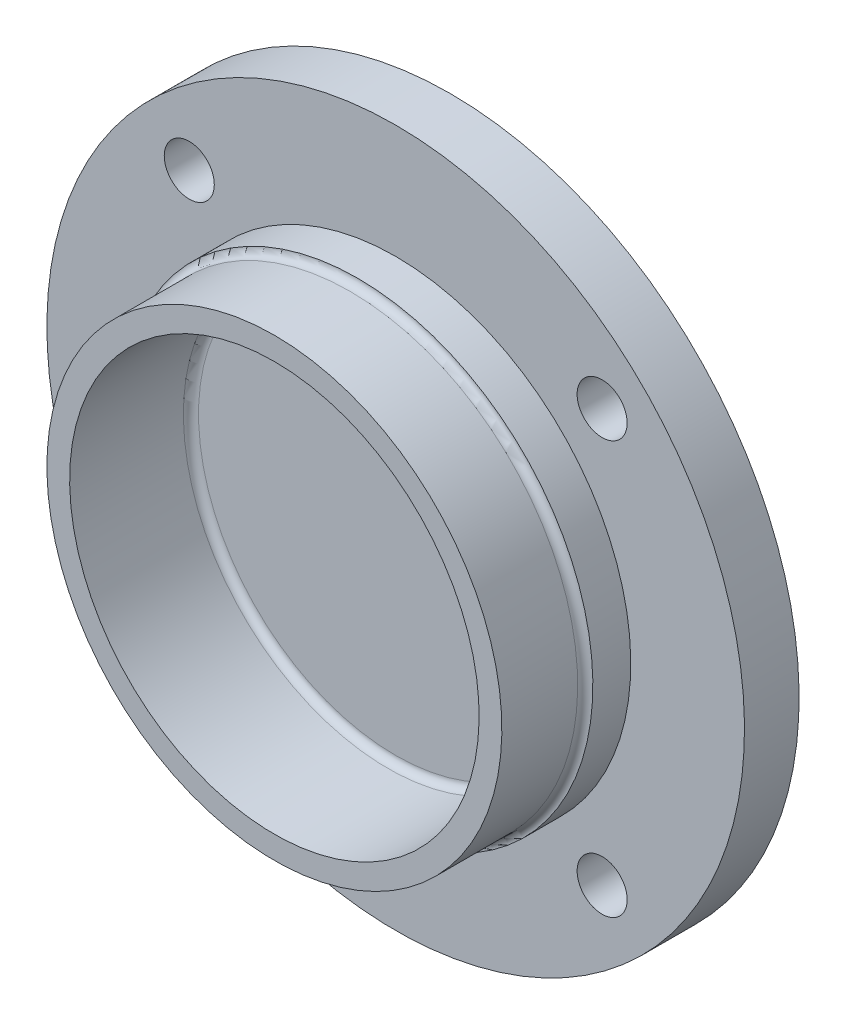
ISO-10303-21;
HEADER;
FILE_DESCRIPTION(('STEP AP214'),'2;1');
FILE_NAME('part.step','',(''),(''),'','','');
FILE_SCHEMA(('AUTOMOTIVE_DESIGN { 1 0 10303 214 1 1 1 1 }'));
ENDSEC;
DATA;
#1=APPLICATION_CONTEXT('core data for automotive mechanical design processes');
#2=APPLICATION_PROTOCOL_DEFINITION('international standard','automotive_design',2000,#1);
#3=PRODUCT_CONTEXT('',#1,'mechanical');
#4=PRODUCT('Part','Part','',(#3));
#5=PRODUCT_RELATED_PRODUCT_CATEGORY('part','',(#4));
#6=PRODUCT_DEFINITION_FORMATION('','',#4);
#7=PRODUCT_DEFINITION_CONTEXT('part definition',#1,'design');
#8=PRODUCT_DEFINITION('design','',#6,#7);
#9=PRODUCT_DEFINITION_SHAPE('','',#8);
#10=(LENGTH_UNIT() NAMED_UNIT(*) SI_UNIT(.MILLI.,.METRE.));
#11=(NAMED_UNIT(*) PLANE_ANGLE_UNIT() SI_UNIT($,.RADIAN.));
#12=(NAMED_UNIT(*) SI_UNIT($,.STERADIAN.) SOLID_ANGLE_UNIT());
#13=UNCERTAINTY_MEASURE_WITH_UNIT(LENGTH_MEASURE(1.E-05),#10,'distance_accuracy_value','');
#14=(GEOMETRIC_REPRESENTATION_CONTEXT(3) GLOBAL_UNCERTAINTY_ASSIGNED_CONTEXT((#13)) GLOBAL_UNIT_ASSIGNED_CONTEXT((#10,
#11,#12)) REPRESENTATION_CONTEXT('',''));
#15=CARTESIAN_POINT('',(0.,0.,0.));
#16=DIRECTION('',(0.,0.,1.));
#17=DIRECTION('',(1.,0.,0.));
#18=AXIS2_PLACEMENT_3D('',#15,#16,#17);
#19=CARTESIAN_POINT('',(0.,29.,-5.2));
#20=DIRECTION('',(0.,0.,-1.));
#21=DIRECTION('',(0.,1.,0.));
#22=AXIS2_PLACEMENT_3D('',#19,#20,#21);
#23=PLANE('',#22);
#24=CARTESIAN_POINT('',(0.,0.,-5.20000000000001));
#25=DIRECTION('',(0.,0.,-1.));
#26=DIRECTION('',(0.,1.,0.));
#27=AXIS2_PLACEMENT_3D('',#24,#25,#26);
#28=CIRCLE('',#27,29.);
#29=CARTESIAN_POINT('',(0.,29.,-5.2));
#30=VERTEX_POINT('',#29);
#31=EDGE_CURVE('E10',#30,#30,#28,.T.);
#32=ORIENTED_EDGE('',*,*,#31,.T.);
#33=EDGE_LOOP('',(#32));
#34=FACE_BOUND('',#33,.T.);
#35=ADVANCED_FACE('F37',(#34),#23,.T.);
#36=CARTESIAN_POINT('',(0.,0.,-5.20000000000001));
#37=DIRECTION('',(0.,0.,-1.));
#38=DIRECTION('',(0.,1.,0.));
#39=AXIS2_PLACEMENT_3D('',#36,#37,#38);
#40=CONICAL_SURFACE('',#39,29.,0.785398163397448);
#41=CARTESIAN_POINT('',(0.,0.,-7.20000000000001));
#42=DIRECTION('',(0.,0.,-1.));
#43=DIRECTION('',(0.,1.,0.));
#44=AXIS2_PLACEMENT_3D('',#41,#42,#43);
#45=CIRCLE('',#44,31.);
#46=CARTESIAN_POINT('',(0.,31.,-7.2));
#47=VERTEX_POINT('',#46);
#48=EDGE_CURVE('E43',#47,#47,#45,.T.);
#49=ORIENTED_EDGE('',*,*,#48,.T.);
#50=EDGE_LOOP('',(#49));
#51=FACE_BOUND('',#50,.T.);
#52=ORIENTED_EDGE('',*,*,#31,.F.);
#53=EDGE_LOOP('',(#52));
#54=FACE_BOUND('',#53,.T.);
#55=ADVANCED_FACE('F109',(#51,#54),#40,.F.);
#56=CARTESIAN_POINT('',(0.,46.,-7.2));
#57=DIRECTION('',(0.,0.,-1.));
#58=DIRECTION('',(0.,1.,0.));
#59=AXIS2_PLACEMENT_3D('',#56,#57,#58);
#60=PLANE('',#59);
#61=CARTESIAN_POINT('',(-27.2236110756823,-27.2236110756818,-7.20000000000001));
#62=DIRECTION('',(0.,0.,-1.));
#63=DIRECTION('',(0.,1.,0.));
#64=AXIS2_PLACEMENT_3D('',#61,#62,#63);
#65=CIRCLE('',#64,3.3);
#66=CARTESIAN_POINT('',(-27.2236110756823,-23.9236110756818,-7.20000000000001));
#67=VERTEX_POINT('',#66);
#68=EDGE_CURVE('E98',#67,#67,#65,.T.);
#69=ORIENTED_EDGE('',*,*,#68,.F.);
#70=EDGE_LOOP('',(#69));
#71=FACE_BOUND('',#70,.T.);
#72=CARTESIAN_POINT('',(27.2236110756821,-27.223611075682,-7.20000000000001));
#73=DIRECTION('',(0.,0.,-1.));
#74=DIRECTION('',(0.,1.,0.));
#75=AXIS2_PLACEMENT_3D('',#72,#73,#74);
#76=CIRCLE('',#75,3.3);
#77=CARTESIAN_POINT('',(27.2236110756821,-23.923611075682,-7.20000000000001));
#78=VERTEX_POINT('',#77);
#79=EDGE_CURVE('E92',#78,#78,#76,.T.);
#80=ORIENTED_EDGE('',*,*,#79,.F.);
#81=EDGE_LOOP('',(#80));
#82=FACE_BOUND('',#81,.T.);
#83=CARTESIAN_POINT('',(27.2236110756821,27.223611075682,-7.2));
#84=DIRECTION('',(0.,0.,-1.));
#85=DIRECTION('',(0.,1.,0.));
#86=AXIS2_PLACEMENT_3D('',#83,#84,#85);
#87=CIRCLE('',#86,3.3);
#88=CARTESIAN_POINT('',(27.2236110756821,30.523611075682,-7.2));
#89=VERTEX_POINT('',#88);
#90=EDGE_CURVE('E86',#89,#89,#87,.T.);
#91=ORIENTED_EDGE('',*,*,#90,.F.);
#92=EDGE_LOOP('',(#91));
#93=FACE_BOUND('',#92,.T.);
#94=CARTESIAN_POINT('',(-27.2236110756821,27.223611075682,-7.2));
#95=DIRECTION('',(0.,0.,-1.));
#96=DIRECTION('',(0.,1.,0.));
#97=AXIS2_PLACEMENT_3D('',#94,#95,#96);
#98=CIRCLE('',#97,3.3);
#99=CARTESIAN_POINT('',(-27.2236110756821,30.523611075682,-7.2));
#100=VERTEX_POINT('',#99);
#101=EDGE_CURVE('E80',#100,#100,#98,.T.);
#102=ORIENTED_EDGE('',*,*,#101,.F.);
#103=EDGE_LOOP('',(#102));
#104=FACE_BOUND('',#103,.T.);
#105=CARTESIAN_POINT('',(0.,0.,-7.2));
#106=DIRECTION('',(0.,0.,-1.));
#107=DIRECTION('',(0.,1.,0.));
#108=AXIS2_PLACEMENT_3D('',#105,#106,#107);
#109=CIRCLE('',#108,46.);
#110=CARTESIAN_POINT('',(0.,46.,-7.2));
#111=VERTEX_POINT('',#110);
#112=EDGE_CURVE('E47',#111,#111,#109,.T.);
#113=ORIENTED_EDGE('',*,*,#112,.T.);
#114=EDGE_LOOP('',(#113));
#115=FACE_BOUND('',#114,.T.);
#116=ORIENTED_EDGE('',*,*,#48,.F.);
#117=EDGE_LOOP('',(#116));
#118=FACE_BOUND('',#117,.T.);
#119=ADVANCED_FACE('F105',(#71,#82,#93,#104,#115,#118),#60,.T.);
#120=CARTESIAN_POINT('',(0.,0.,-7.2));
#121=DIRECTION('',(0.,0.,-1.));
#122=DIRECTION('',(0.,1.,0.));
#123=AXIS2_PLACEMENT_3D('',#120,#121,#122);
#124=CYLINDRICAL_SURFACE('',#123,46.);
#125=CARTESIAN_POINT('',(0.,0.,0.));
#126=DIRECTION('',(0.,0.,-1.));
#127=DIRECTION('',(0.,1.,0.));
#128=AXIS2_PLACEMENT_3D('',#125,#126,#127);
#129=CIRCLE('',#128,46.);
#130=CARTESIAN_POINT('',(0.,46.,0.));
#131=VERTEX_POINT('',#130);
#132=EDGE_CURVE('E51',#131,#131,#129,.T.);
#133=ORIENTED_EDGE('',*,*,#132,.T.);
#134=EDGE_LOOP('',(#133));
#135=FACE_BOUND('',#134,.T.);
#136=ORIENTED_EDGE('',*,*,#112,.F.);
#137=EDGE_LOOP('',(#136));
#138=FACE_BOUND('',#137,.T.);
#139=ADVANCED_FACE('F108',(#135,#138),#124,.T.);
#140=CARTESIAN_POINT('',(0.,31.,0.));
#141=DIRECTION('',(0.,0.,1.));
#142=DIRECTION('',(0.,-1.,0.));
#143=AXIS2_PLACEMENT_3D('',#140,#141,#142);
#144=PLANE('',#143);
#145=CARTESIAN_POINT('',(-27.2236110756823,-27.2236110756818,0.));
#146=DIRECTION('',(0.,0.,1.));
#147=DIRECTION('',(0.,-1.,0.));
#148=AXIS2_PLACEMENT_3D('',#145,#146,#147);
#149=CIRCLE('',#148,3.3);
#150=CARTESIAN_POINT('',(-27.2236110756823,-30.5236110756818,0.));
#151=VERTEX_POINT('',#150);
#152=EDGE_CURVE('E95',#151,#151,#149,.T.);
#153=ORIENTED_EDGE('',*,*,#152,.F.);
#154=EDGE_LOOP('',(#153));
#155=FACE_BOUND('',#154,.T.);
#156=CARTESIAN_POINT('',(27.2236110756821,-27.223611075682,0.));
#157=DIRECTION('',(0.,0.,1.));
#158=DIRECTION('',(0.,-1.,0.));
#159=AXIS2_PLACEMENT_3D('',#156,#157,#158);
#160=CIRCLE('',#159,3.3);
#161=CARTESIAN_POINT('',(27.2236110756821,-30.523611075682,0.));
#162=VERTEX_POINT('',#161);
#163=EDGE_CURVE('E89',#162,#162,#160,.T.);
#164=ORIENTED_EDGE('',*,*,#163,.F.);
#165=EDGE_LOOP('',(#164));
#166=FACE_BOUND('',#165,.T.);
#167=CARTESIAN_POINT('',(27.2236110756821,27.223611075682,0.));
#168=DIRECTION('',(0.,0.,1.));
#169=DIRECTION('',(0.,-1.,0.));
#170=AXIS2_PLACEMENT_3D('',#167,#168,#169);
#171=CIRCLE('',#170,3.3);
#172=CARTESIAN_POINT('',(27.2236110756821,23.923611075682,0.));
#173=VERTEX_POINT('',#172);
#174=EDGE_CURVE('E83',#173,#173,#171,.T.);
#175=ORIENTED_EDGE('',*,*,#174,.F.);
#176=EDGE_LOOP('',(#175));
#177=FACE_BOUND('',#176,.T.);
#178=CARTESIAN_POINT('',(-27.2236110756821,27.223611075682,0.));
#179=DIRECTION('',(0.,0.,1.));
#180=DIRECTION('',(0.,-1.,0.));
#181=AXIS2_PLACEMENT_3D('',#178,#179,#180);
#182=CIRCLE('',#181,3.3);
#183=CARTESIAN_POINT('',(-27.2236110756821,23.923611075682,0.));
#184=VERTEX_POINT('',#183);
#185=EDGE_CURVE('E77',#184,#184,#182,.T.);
#186=ORIENTED_EDGE('',*,*,#185,.F.);
#187=EDGE_LOOP('',(#186));
#188=FACE_BOUND('',#187,.T.);
#189=CARTESIAN_POINT('',(0.,0.,0.));
#190=DIRECTION('',(0.,0.,-1.));
#191=DIRECTION('',(0.,1.,0.));
#192=AXIS2_PLACEMENT_3D('',#189,#190,#191);
#193=CIRCLE('',#192,31.);
#194=CARTESIAN_POINT('',(0.,31.,0.));
#195=VERTEX_POINT('',#194);
#196=EDGE_CURVE('E56',#195,#195,#193,.T.);
#197=ORIENTED_EDGE('',*,*,#196,.T.);
#198=EDGE_LOOP('',(#197));
#199=FACE_BOUND('',#198,.T.);
#200=ORIENTED_EDGE('',*,*,#132,.F.);
#201=EDGE_LOOP('',(#200));
#202=FACE_BOUND('',#201,.T.);
#203=ADVANCED_FACE('F121',(#155,#166,#177,#188,#199,#202),#144,.T.);
#204=CARTESIAN_POINT('',(0.,0.,-7.2));
#205=DIRECTION('',(0.,0.,-1.));
#206=DIRECTION('',(0.,1.,0.));
#207=AXIS2_PLACEMENT_3D('',#204,#205,#206);
#208=CYLINDRICAL_SURFACE('',#207,31.);
#209=CARTESIAN_POINT('',(0.,0.,5.));
#210=DIRECTION('',(0.,0.,-1.));
#211=DIRECTION('',(0.,1.,0.));
#212=AXIS2_PLACEMENT_3D('',#209,#210,#211);
#213=CIRCLE('',#212,31.);
#214=CARTESIAN_POINT('',(0.,31.,5.));
#215=VERTEX_POINT('',#214);
#216=EDGE_CURVE('E59',#215,#215,#213,.T.);
#217=ORIENTED_EDGE('',*,*,#216,.T.);
#218=EDGE_LOOP('',(#217));
#219=FACE_BOUND('',#218,.T.);
#220=ORIENTED_EDGE('',*,*,#196,.F.);
#221=EDGE_LOOP('',(#220));
#222=FACE_BOUND('',#221,.T.);
#223=ADVANCED_FACE('F129',(#219,#222),#208,.T.);
#224=CARTESIAN_POINT('',(0.,0.,6.));
#225=DIRECTION('',(0.,0.,-1.));
#226=DIRECTION('',(0.,1.,0.));
#227=AXIS2_PLACEMENT_3D('',#224,#225,#226);
#228=TOROIDAL_SURFACE('',#227,31.,1.);
#229=CARTESIAN_POINT('',(0.,0.,6.));
#230=DIRECTION('',(0.,0.,-1.));
#231=DIRECTION('',(0.,1.,0.));
#232=AXIS2_PLACEMENT_3D('',#229,#230,#231);
#233=CIRCLE('',#232,30.);
#234=CARTESIAN_POINT('',(0.,30.,6.));
#235=VERTEX_POINT('',#234);
#236=EDGE_CURVE('E62',#235,#235,#233,.T.);
#237=ORIENTED_EDGE('',*,*,#236,.T.);
#238=EDGE_LOOP('',(#237));
#239=FACE_BOUND('',#238,.T.);
#240=ORIENTED_EDGE('',*,*,#216,.F.);
#241=EDGE_LOOP('',(#240));
#242=FACE_BOUND('',#241,.T.);
#243=ADVANCED_FACE('F158',(#239,#242),#228,.F.);
#244=CARTESIAN_POINT('',(0.,0.,-7.2));
#245=DIRECTION('',(0.,0.,-1.));
#246=DIRECTION('',(0.,1.,0.));
#247=AXIS2_PLACEMENT_3D('',#244,#245,#246);
#248=CYLINDRICAL_SURFACE('',#247,30.);
#249=CARTESIAN_POINT('',(0.,0.,16.));
#250=DIRECTION('',(0.,0.,-1.));
#251=DIRECTION('',(0.,1.,0.));
#252=AXIS2_PLACEMENT_3D('',#249,#250,#251);
#253=CIRCLE('',#252,30.);
#254=CARTESIAN_POINT('',(0.,30.,16.));
#255=VERTEX_POINT('',#254);
#256=EDGE_CURVE('E65',#255,#255,#253,.T.);
#257=ORIENTED_EDGE('',*,*,#256,.T.);
#258=EDGE_LOOP('',(#257));
#259=FACE_BOUND('',#258,.T.);
#260=ORIENTED_EDGE('',*,*,#236,.F.);
#261=EDGE_LOOP('',(#260));
#262=FACE_BOUND('',#261,.T.);
#263=ADVANCED_FACE('F166',(#259,#262),#248,.T.);
#264=CARTESIAN_POINT('',(0.,27.,16.));
#265=DIRECTION('',(0.,0.,1.));
#266=DIRECTION('',(0.,-1.,0.));
#267=AXIS2_PLACEMENT_3D('',#264,#265,#266);
#268=PLANE('',#267);
#269=CARTESIAN_POINT('',(0.,0.,16.));
#270=DIRECTION('',(0.,0.,-1.));
#271=DIRECTION('',(0.,1.,0.));
#272=AXIS2_PLACEMENT_3D('',#269,#270,#271);
#273=CIRCLE('',#272,27.);
#274=CARTESIAN_POINT('',(0.,27.,16.));
#275=VERTEX_POINT('',#274);
#276=EDGE_CURVE('E68',#275,#275,#273,.T.);
#277=ORIENTED_EDGE('',*,*,#276,.T.);
#278=EDGE_LOOP('',(#277));
#279=FACE_BOUND('',#278,.T.);
#280=ORIENTED_EDGE('',*,*,#256,.F.);
#281=EDGE_LOOP('',(#280));
#282=FACE_BOUND('',#281,.T.);
#283=ADVANCED_FACE('F174',(#279,#282),#268,.T.);
#284=CARTESIAN_POINT('',(0.,0.,-7.2));
#285=DIRECTION('',(0.,0.,-1.));
#286=DIRECTION('',(0.,1.,0.));
#287=AXIS2_PLACEMENT_3D('',#284,#285,#286);
#288=CYLINDRICAL_SURFACE('',#287,27.);
#289=CARTESIAN_POINT('',(0.,0.,0.999999999999997));
#290=DIRECTION('',(0.,0.,-1.));
#291=DIRECTION('',(0.,1.,0.));
#292=AXIS2_PLACEMENT_3D('',#289,#290,#291);
#293=CIRCLE('',#292,27.);
#294=CARTESIAN_POINT('',(0.,27.,1.));
#295=VERTEX_POINT('',#294);
#296=EDGE_CURVE('E71',#295,#295,#293,.T.);
#297=ORIENTED_EDGE('',*,*,#296,.T.);
#298=EDGE_LOOP('',(#297));
#299=FACE_BOUND('',#298,.T.);
#300=ORIENTED_EDGE('',*,*,#276,.F.);
#301=EDGE_LOOP('',(#300));
#302=FACE_BOUND('',#301,.T.);
#303=ADVANCED_FACE('F182',(#299,#302),#288,.F.);
#304=CARTESIAN_POINT('',(0.,0.,0.999999999999997));
#305=DIRECTION('',(0.,0.,-1.));
#306=DIRECTION('',(0.,1.,0.));
#307=AXIS2_PLACEMENT_3D('',#304,#305,#306);
#308=TOROIDAL_SURFACE('',#307,26.,1.);
#309=CARTESIAN_POINT('',(0.,0.,0.));
#310=DIRECTION('',(0.,0.,-1.));
#311=DIRECTION('',(0.,1.,0.));
#312=AXIS2_PLACEMENT_3D('',#309,#310,#311);
#313=CIRCLE('',#312,26.);
#314=CARTESIAN_POINT('',(0.,26.,0.));
#315=VERTEX_POINT('',#314);
#316=EDGE_CURVE('E74',#315,#315,#313,.T.);
#317=ORIENTED_EDGE('',*,*,#316,.T.);
#318=EDGE_LOOP('',(#317));
#319=FACE_BOUND('',#318,.T.);
#320=ORIENTED_EDGE('',*,*,#296,.F.);
#321=EDGE_LOOP('',(#320));
#322=FACE_BOUND('',#321,.T.);
#323=ADVANCED_FACE('F190',(#319,#322),#308,.F.);
#324=CARTESIAN_POINT('',(0.,0.,0.));
#325=DIRECTION('',(0.,0.,1.));
#326=DIRECTION('',(0.,-1.,0.));
#327=AXIS2_PLACEMENT_3D('',#324,#325,#326);
#328=PLANE('',#327);
#329=ORIENTED_EDGE('',*,*,#316,.F.);
#330=EDGE_LOOP('',(#329));
#331=FACE_BOUND('',#330,.T.);
#332=ADVANCED_FACE('F198',(#331),#328,.T.);
#333=CARTESIAN_POINT('',(-27.2236110756821,27.223611075682,-7.2));
#334=DIRECTION('',(0.,0.,-1.));
#335=DIRECTION('',(0.,1.,0.));
#336=AXIS2_PLACEMENT_3D('',#333,#334,#335);
#337=CYLINDRICAL_SURFACE('',#336,3.3);
#338=ORIENTED_EDGE('',*,*,#101,.T.);
#339=EDGE_LOOP('',(#338));
#340=FACE_BOUND('',#339,.T.);
#341=ORIENTED_EDGE('',*,*,#185,.T.);
#342=EDGE_LOOP('',(#341));
#343=FACE_BOUND('',#342,.T.);
#344=ADVANCED_FACE('F206',(#340,#343),#337,.F.);
#345=CARTESIAN_POINT('',(27.2236110756821,27.223611075682,-7.2));
#346=DIRECTION('',(0.,0.,-1.));
#347=DIRECTION('',(0.,1.,0.));
#348=AXIS2_PLACEMENT_3D('',#345,#346,#347);
#349=CYLINDRICAL_SURFACE('',#348,3.3);
#350=ORIENTED_EDGE('',*,*,#90,.T.);
#351=EDGE_LOOP('',(#350));
#352=FACE_BOUND('',#351,.T.);
#353=ORIENTED_EDGE('',*,*,#174,.T.);
#354=EDGE_LOOP('',(#353));
#355=FACE_BOUND('',#354,.T.);
#356=ADVANCED_FACE('F213',(#352,#355),#349,.F.);
#357=CARTESIAN_POINT('',(27.2236110756821,-27.223611075682,-7.20000000000001));
#358=DIRECTION('',(0.,0.,-1.));
#359=DIRECTION('',(0.,1.,0.));
#360=AXIS2_PLACEMENT_3D('',#357,#358,#359);
#361=CYLINDRICAL_SURFACE('',#360,3.3);
#362=ORIENTED_EDGE('',*,*,#79,.T.);
#363=EDGE_LOOP('',(#362));
#364=FACE_BOUND('',#363,.T.);
#365=ORIENTED_EDGE('',*,*,#163,.T.);
#366=EDGE_LOOP('',(#365));
#367=FACE_BOUND('',#366,.T.);
#368=ADVANCED_FACE('F220',(#364,#367),#361,.F.);
#369=CARTESIAN_POINT('',(-27.2236110756823,-27.2236110756818,-7.20000000000001));
#370=DIRECTION('',(0.,0.,-1.));
#371=DIRECTION('',(0.,1.,0.));
#372=AXIS2_PLACEMENT_3D('',#369,#370,#371);
#373=CYLINDRICAL_SURFACE('',#372,3.3);
#374=ORIENTED_EDGE('',*,*,#68,.T.);
#375=EDGE_LOOP('',(#374));
#376=FACE_BOUND('',#375,.T.);
#377=ORIENTED_EDGE('',*,*,#152,.T.);
#378=EDGE_LOOP('',(#377));
#379=FACE_BOUND('',#378,.T.);
#380=ADVANCED_FACE('F102',(#376,#379),#373,.F.);
#381=CLOSED_SHELL('',(#35,#55,#119,#139,#203,#223,#243,#263,#283,#303,#323,#332,#344,#356,#368,#380));
#382=MANIFOLD_SOLID_BREP('B2',#381);
#383=ADVANCED_BREP_SHAPE_REPRESENTATION('',(#18,#382),#14);
#384=SHAPE_DEFINITION_REPRESENTATION(#9,#383);
ENDSEC;
END-ISO-10303-21;
